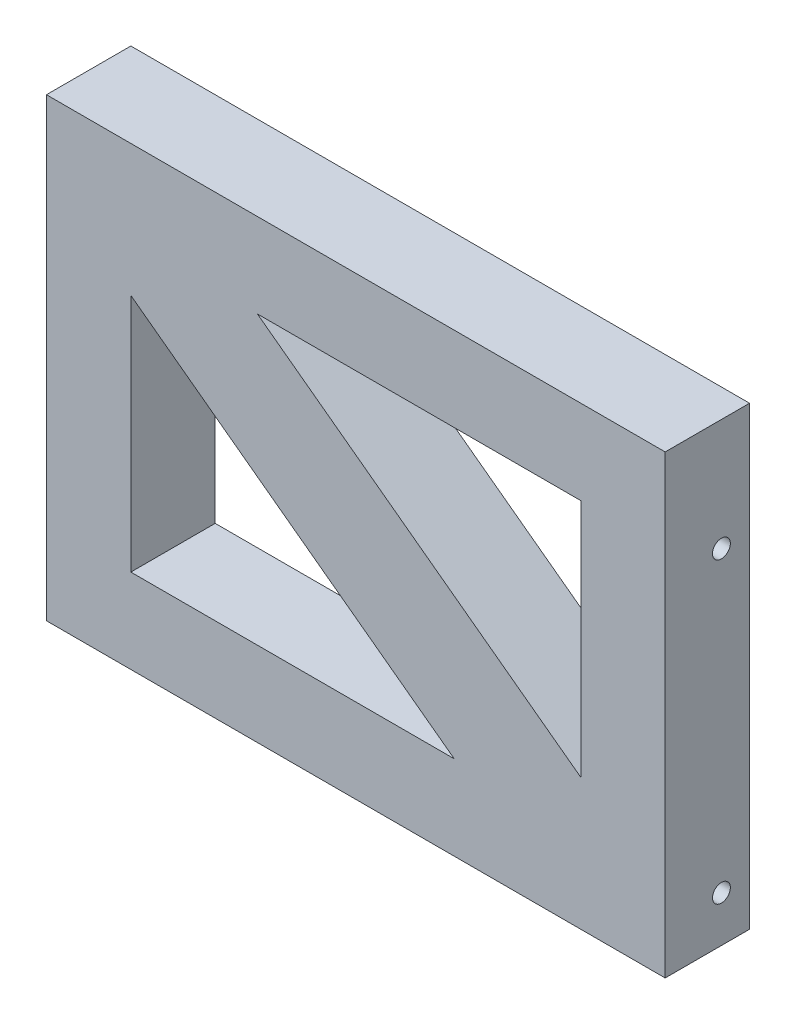
ISO-10303-21;
HEADER;
FILE_DESCRIPTION(('STEP AP214'),'2;1');
FILE_NAME('part.step','',(''),(''),'','','');
FILE_SCHEMA(('AUTOMOTIVE_DESIGN { 1 0 10303 214 1 1 1 1 }'));
ENDSEC;
DATA;
#1=APPLICATION_CONTEXT('core data for automotive mechanical design processes');
#2=APPLICATION_PROTOCOL_DEFINITION('international standard','automotive_design',2000,#1);
#3=PRODUCT_CONTEXT('',#1,'mechanical');
#4=PRODUCT('Part','Part','',(#3));
#5=PRODUCT_RELATED_PRODUCT_CATEGORY('part','',(#4));
#6=PRODUCT_DEFINITION_FORMATION('','',#4);
#7=PRODUCT_DEFINITION_CONTEXT('part definition',#1,'design');
#8=PRODUCT_DEFINITION('design','',#6,#7);
#9=PRODUCT_DEFINITION_SHAPE('','',#8);
#10=(LENGTH_UNIT() NAMED_UNIT(*) SI_UNIT(.MILLI.,.METRE.));
#11=(NAMED_UNIT(*) PLANE_ANGLE_UNIT() SI_UNIT($,.RADIAN.));
#12=(NAMED_UNIT(*) SI_UNIT($,.STERADIAN.) SOLID_ANGLE_UNIT());
#13=UNCERTAINTY_MEASURE_WITH_UNIT(LENGTH_MEASURE(1.E-05),#10,'distance_accuracy_value','');
#14=(GEOMETRIC_REPRESENTATION_CONTEXT(3) GLOBAL_UNCERTAINTY_ASSIGNED_CONTEXT((#13)) GLOBAL_UNIT_ASSIGNED_CONTEXT((#10,
#11,#12)) REPRESENTATION_CONTEXT('',''));
#15=CARTESIAN_POINT('',(0.,0.,0.));
#16=DIRECTION('',(0.,0.,1.));
#17=DIRECTION('',(1.,0.,0.));
#18=AXIS2_PLACEMENT_3D('',#15,#16,#17);
#19=CARTESIAN_POINT('',(0.,102.87,19.05));
#20=DIRECTION('',(0.,0.,-1.));
#21=DIRECTION('',(-1.,0.,0.));
#22=AXIS2_PLACEMENT_3D('',#19,#20,#21);
#23=PLANE('',#22);
#24=DIRECTION('',(1.,0.,0.));
#25=VECTOR('',#24,1.);
#26=CARTESIAN_POINT('',(19.05,19.05,19.05));
#27=LINE('',#26,#25);
#28=CARTESIAN_POINT('',(19.05,19.05,19.05));
#29=VERTEX_POINT('',#28);
#30=CARTESIAN_POINT('',(92.075,19.05,19.05));
#31=VERTEX_POINT('',#30);
#32=EDGE_CURVE('E177',#29,#31,#27,.T.);
#33=ORIENTED_EDGE('',*,*,#32,.F.);
#34=DIRECTION('',(0.,-1.,0.));
#35=VECTOR('',#34,1.);
#36=CARTESIAN_POINT('',(19.05,19.05,19.05));
#37=LINE('',#36,#35);
#38=CARTESIAN_POINT('',(19.05,73.152,19.05));
#39=VERTEX_POINT('',#38);
#40=EDGE_CURVE('E183',#39,#29,#37,.T.);
#41=ORIENTED_EDGE('',*,*,#40,.F.);
#42=DIRECTION('',(-0.803507681099584,0.595294386345083,0.));
#43=VECTOR('',#42,1.);
#44=CARTESIAN_POINT('',(19.05,73.152,19.05));
#45=LINE('',#44,#43);
#46=EDGE_CURVE('E179',#31,#39,#45,.T.);
#47=ORIENTED_EDGE('',*,*,#46,.F.);
#48=EDGE_LOOP('',(#33,#41,#47));
#49=FACE_BOUND('',#48,.T.);
#50=DIRECTION('',(0.,-1.,0.));
#51=VECTOR('',#50,1.);
#52=CARTESIAN_POINT('',(0.,0.,19.05));
#53=LINE('',#52,#51);
#54=CARTESIAN_POINT('',(0.,102.87,19.05));
#55=VERTEX_POINT('',#54);
#56=CARTESIAN_POINT('',(0.,0.,19.05));
#57=VERTEX_POINT('',#56);
#58=EDGE_CURVE('E201',#55,#57,#53,.T.);
#59=ORIENTED_EDGE('',*,*,#58,.T.);
#60=DIRECTION('',(1.,0.,0.));
#61=VECTOR('',#60,1.);
#62=CARTESIAN_POINT('',(0.,0.,19.05));
#63=LINE('',#62,#61);
#64=CARTESIAN_POINT('',(139.7,0.,19.05));
#65=VERTEX_POINT('',#64);
#66=EDGE_CURVE('E204',#57,#65,#63,.T.);
#67=ORIENTED_EDGE('',*,*,#66,.T.);
#68=DIRECTION('',(0.,1.,0.));
#69=VECTOR('',#68,1.);
#70=CARTESIAN_POINT('',(139.7,0.,19.05));
#71=LINE('',#70,#69);
#72=CARTESIAN_POINT('',(139.7,102.87,19.05));
#73=VERTEX_POINT('',#72);
#74=EDGE_CURVE('E207',#65,#73,#71,.T.);
#75=ORIENTED_EDGE('',*,*,#74,.T.);
#76=DIRECTION('',(-1.,0.,0.));
#77=VECTOR('',#76,1.);
#78=CARTESIAN_POINT('',(0.,102.87,19.05));
#79=LINE('',#78,#77);
#80=EDGE_CURVE('E209',#73,#55,#79,.T.);
#81=ORIENTED_EDGE('',*,*,#80,.T.);
#82=EDGE_LOOP('',(#59,#67,#75,#81));
#83=FACE_BOUND('',#82,.T.);
#84=DIRECTION('',(-1.,0.,0.));
#85=VECTOR('',#84,1.);
#86=CARTESIAN_POINT('',(120.65,83.82,19.05));
#87=LINE('',#86,#85);
#88=CARTESIAN_POINT('',(120.65,83.82,19.05));
#89=VERTEX_POINT('',#88);
#90=CARTESIAN_POINT('',(47.625,83.82,19.05));
#91=VERTEX_POINT('',#90);
#92=EDGE_CURVE('E158',#89,#91,#87,.T.);
#93=ORIENTED_EDGE('',*,*,#92,.F.);
#94=DIRECTION('',(0.,1.,0.));
#95=VECTOR('',#94,1.);
#96=CARTESIAN_POINT('',(120.65,83.82,19.05));
#97=LINE('',#96,#95);
#98=CARTESIAN_POINT('',(120.65,29.718,19.05));
#99=VERTEX_POINT('',#98);
#100=EDGE_CURVE('E163',#99,#89,#97,.T.);
#101=ORIENTED_EDGE('',*,*,#100,.F.);
#102=DIRECTION('',(0.803507681099584,-0.595294386345083,0.));
#103=VECTOR('',#102,1.);
#104=CARTESIAN_POINT('',(47.625,83.82,19.05));
#105=LINE('',#104,#103);
#106=EDGE_CURVE('E160',#91,#99,#105,.T.);
#107=ORIENTED_EDGE('',*,*,#106,.F.);
#108=EDGE_LOOP('',(#93,#101,#107));
#109=FACE_BOUND('',#108,.T.);
#110=ADVANCED_FACE('F36',(#49,#83,#109),#23,.F.);
#111=CARTESIAN_POINT('',(0.,102.87,0.));
#112=DIRECTION('',(0.,0.,-1.));
#113=DIRECTION('',(-1.,0.,0.));
#114=AXIS2_PLACEMENT_3D('',#111,#112,#113);
#115=PLANE('',#114);
#116=DIRECTION('',(0.,-1.,0.));
#117=VECTOR('',#116,1.);
#118=CARTESIAN_POINT('',(19.05,19.05,0.));
#119=LINE('',#118,#117);
#120=CARTESIAN_POINT('',(19.05,73.152,0.));
#121=VERTEX_POINT('',#120);
#122=CARTESIAN_POINT('',(19.05,19.05,0.));
#123=VERTEX_POINT('',#122);
#124=EDGE_CURVE('E180',#121,#123,#119,.T.);
#125=ORIENTED_EDGE('',*,*,#124,.T.);
#126=DIRECTION('',(1.,0.,0.));
#127=VECTOR('',#126,1.);
#128=CARTESIAN_POINT('',(19.05,19.05,0.));
#129=LINE('',#128,#127);
#130=CARTESIAN_POINT('',(92.075,19.05,0.));
#131=VERTEX_POINT('',#130);
#132=EDGE_CURVE('E176',#123,#131,#129,.T.);
#133=ORIENTED_EDGE('',*,*,#132,.T.);
#134=DIRECTION('',(-0.803507681099584,0.595294386345083,0.));
#135=VECTOR('',#134,1.);
#136=CARTESIAN_POINT('',(19.05,73.152,0.));
#137=LINE('',#136,#135);
#138=EDGE_CURVE('E188',#131,#121,#137,.T.);
#139=ORIENTED_EDGE('',*,*,#138,.T.);
#140=EDGE_LOOP('',(#125,#133,#139));
#141=FACE_BOUND('',#140,.T.);
#142=DIRECTION('',(0.,-1.,0.));
#143=VECTOR('',#142,1.);
#144=CARTESIAN_POINT('',(0.,0.,0.));
#145=LINE('',#144,#143);
#146=CARTESIAN_POINT('',(0.,102.87,0.));
#147=VERTEX_POINT('',#146);
#148=CARTESIAN_POINT('',(0.,0.,0.));
#149=VERTEX_POINT('',#148);
#150=EDGE_CURVE('E200',#147,#149,#145,.T.);
#151=ORIENTED_EDGE('',*,*,#150,.F.);
#152=DIRECTION('',(-1.,0.,0.));
#153=VECTOR('',#152,1.);
#154=CARTESIAN_POINT('',(0.,102.87,0.));
#155=LINE('',#154,#153);
#156=CARTESIAN_POINT('',(139.7,102.87,0.));
#157=VERTEX_POINT('',#156);
#158=EDGE_CURVE('E205',#157,#147,#155,.T.);
#159=ORIENTED_EDGE('',*,*,#158,.F.);
#160=DIRECTION('',(0.,1.,0.));
#161=VECTOR('',#160,1.);
#162=CARTESIAN_POINT('',(139.7,0.,0.));
#163=LINE('',#162,#161);
#164=CARTESIAN_POINT('',(139.7,0.,0.));
#165=VERTEX_POINT('',#164);
#166=EDGE_CURVE('E216',#165,#157,#163,.T.);
#167=ORIENTED_EDGE('',*,*,#166,.F.);
#168=DIRECTION('',(1.,0.,0.));
#169=VECTOR('',#168,1.);
#170=CARTESIAN_POINT('',(0.,0.,0.));
#171=LINE('',#170,#169);
#172=EDGE_CURVE('E214',#149,#165,#171,.T.);
#173=ORIENTED_EDGE('',*,*,#172,.F.);
#174=EDGE_LOOP('',(#151,#159,#167,#173));
#175=FACE_BOUND('',#174,.T.);
#176=DIRECTION('',(0.,1.,0.));
#177=VECTOR('',#176,1.);
#178=CARTESIAN_POINT('',(120.65,83.82,0.));
#179=LINE('',#178,#177);
#180=CARTESIAN_POINT('',(120.65,29.718,0.));
#181=VERTEX_POINT('',#180);
#182=CARTESIAN_POINT('',(120.65,83.82,0.));
#183=VERTEX_POINT('',#182);
#184=EDGE_CURVE('E161',#181,#183,#179,.T.);
#185=ORIENTED_EDGE('',*,*,#184,.T.);
#186=DIRECTION('',(-1.,0.,0.));
#187=VECTOR('',#186,1.);
#188=CARTESIAN_POINT('',(120.65,83.82,0.));
#189=LINE('',#188,#187);
#190=CARTESIAN_POINT('',(47.625,83.82,0.));
#191=VERTEX_POINT('',#190);
#192=EDGE_CURVE('E59',#183,#191,#189,.T.);
#193=ORIENTED_EDGE('',*,*,#192,.T.);
#194=DIRECTION('',(0.803507681099584,-0.595294386345083,0.));
#195=VECTOR('',#194,1.);
#196=CARTESIAN_POINT('',(47.625,83.82,0.));
#197=LINE('',#196,#195);
#198=EDGE_CURVE('E167',#191,#181,#197,.T.);
#199=ORIENTED_EDGE('',*,*,#198,.T.);
#200=EDGE_LOOP('',(#185,#193,#199));
#201=FACE_BOUND('',#200,.T.);
#202=ADVANCED_FACE('F234',(#141,#175,#201),#115,.T.);
#203=CARTESIAN_POINT('',(0.,0.,19.05));
#204=DIRECTION('',(1.,0.,0.));
#205=DIRECTION('',(0.,0.,-1.));
#206=AXIS2_PLACEMENT_3D('',#203,#204,#205);
#207=PLANE('',#206);
#208=CARTESIAN_POINT('',(0.,77.63256,6.35));
#209=DIRECTION('',(-1.,0.,0.));
#210=DIRECTION('',(0.,0.,1.));
#211=AXIS2_PLACEMENT_3D('',#208,#209,#210);
#212=CIRCLE('',#211,2.01929999999999);
#213=CARTESIAN_POINT('',(0.,77.63256,8.36929999999999));
#214=VERTEX_POINT('',#213);
#215=EDGE_CURVE('E136',#214,#214,#212,.T.);
#216=ORIENTED_EDGE('',*,*,#215,.F.);
#217=EDGE_LOOP('',(#216));
#218=FACE_BOUND('',#217,.T.);
#219=CARTESIAN_POINT('',(0.,10.32256,6.35));
#220=DIRECTION('',(-1.,0.,0.));
#221=DIRECTION('',(0.,0.,1.));
#222=AXIS2_PLACEMENT_3D('',#219,#220,#221);
#223=CIRCLE('',#222,2.01929999999999);
#224=CARTESIAN_POINT('',(0.,10.32256,8.36929999999999));
#225=VERTEX_POINT('',#224);
#226=EDGE_CURVE('E135',#225,#225,#223,.T.);
#227=ORIENTED_EDGE('',*,*,#226,.F.);
#228=EDGE_LOOP('',(#227));
#229=FACE_BOUND('',#228,.T.);
#230=ORIENTED_EDGE('',*,*,#150,.T.);
#231=DIRECTION('',(0.,0.,-1.));
#232=VECTOR('',#231,1.);
#233=CARTESIAN_POINT('',(0.,0.,19.05));
#234=LINE('',#233,#232);
#235=EDGE_CURVE('E11',#57,#149,#234,.T.);
#236=ORIENTED_EDGE('',*,*,#235,.F.);
#237=ORIENTED_EDGE('',*,*,#58,.F.);
#238=DIRECTION('',(0.,0.,-1.));
#239=VECTOR('',#238,1.);
#240=CARTESIAN_POINT('',(0.,102.87,19.05));
#241=LINE('',#240,#239);
#242=EDGE_CURVE('E211',#55,#147,#241,.T.);
#243=ORIENTED_EDGE('',*,*,#242,.T.);
#244=EDGE_LOOP('',(#230,#236,#237,#243));
#245=FACE_BOUND('',#244,.T.);
#246=ADVANCED_FACE('F38',(#218,#229,#245),#207,.F.);
#247=CARTESIAN_POINT('',(0.,0.,19.05));
#248=DIRECTION('',(0.,1.,0.));
#249=DIRECTION('',(0.,0.,1.));
#250=AXIS2_PLACEMENT_3D('',#247,#248,#249);
#251=PLANE('',#250);
#252=ORIENTED_EDGE('',*,*,#172,.T.);
#253=DIRECTION('',(0.,0.,-1.));
#254=VECTOR('',#253,1.);
#255=CARTESIAN_POINT('',(139.7,0.,19.05));
#256=LINE('',#255,#254);
#257=EDGE_CURVE('E44',#65,#165,#256,.T.);
#258=ORIENTED_EDGE('',*,*,#257,.F.);
#259=ORIENTED_EDGE('',*,*,#66,.F.);
#260=ORIENTED_EDGE('',*,*,#235,.T.);
#261=EDGE_LOOP('',(#252,#258,#259,#260));
#262=FACE_BOUND('',#261,.T.);
#263=ADVANCED_FACE('F245',(#262),#251,.F.);
#264=CARTESIAN_POINT('',(139.7,0.,19.05));
#265=DIRECTION('',(-1.,0.,0.));
#266=DIRECTION('',(0.,0.,1.));
#267=AXIS2_PLACEMENT_3D('',#264,#265,#266);
#268=PLANE('',#267);
#269=CARTESIAN_POINT('',(139.7,10.32256,6.35));
#270=DIRECTION('',(1.,0.,0.));
#271=DIRECTION('',(0.,0.,-1.));
#272=AXIS2_PLACEMENT_3D('',#269,#270,#271);
#273=CIRCLE('',#272,2.01929999999999);
#274=CARTESIAN_POINT('',(139.7,10.32256,4.33070000000001));
#275=VERTEX_POINT('',#274);
#276=EDGE_CURVE('E146',#275,#275,#273,.T.);
#277=ORIENTED_EDGE('',*,*,#276,.F.);
#278=EDGE_LOOP('',(#277));
#279=FACE_BOUND('',#278,.T.);
#280=CARTESIAN_POINT('',(139.7,77.63256,6.35));
#281=DIRECTION('',(1.,0.,0.));
#282=DIRECTION('',(0.,0.,-1.));
#283=AXIS2_PLACEMENT_3D('',#280,#281,#282);
#284=CIRCLE('',#283,2.01929999999999);
#285=CARTESIAN_POINT('',(139.7,77.63256,4.33070000000001));
#286=VERTEX_POINT('',#285);
#287=EDGE_CURVE('E152',#286,#286,#284,.T.);
#288=ORIENTED_EDGE('',*,*,#287,.F.);
#289=EDGE_LOOP('',(#288));
#290=FACE_BOUND('',#289,.T.);
#291=ORIENTED_EDGE('',*,*,#166,.T.);
#292=DIRECTION('',(0.,0.,-1.));
#293=VECTOR('',#292,1.);
#294=CARTESIAN_POINT('',(139.7,102.87,19.05));
#295=LINE('',#294,#293);
#296=EDGE_CURVE('E221',#73,#157,#295,.T.);
#297=ORIENTED_EDGE('',*,*,#296,.F.);
#298=ORIENTED_EDGE('',*,*,#74,.F.);
#299=ORIENTED_EDGE('',*,*,#257,.T.);
#300=EDGE_LOOP('',(#291,#297,#298,#299));
#301=FACE_BOUND('',#300,.T.);
#302=ADVANCED_FACE('F228',(#279,#290,#301),#268,.F.);
#303=CARTESIAN_POINT('',(0.,102.87,19.05));
#304=DIRECTION('',(0.,-1.,0.));
#305=DIRECTION('',(0.,0.,-1.));
#306=AXIS2_PLACEMENT_3D('',#303,#304,#305);
#307=PLANE('',#306);
#308=ORIENTED_EDGE('',*,*,#158,.T.);
#309=ORIENTED_EDGE('',*,*,#242,.F.);
#310=ORIENTED_EDGE('',*,*,#80,.F.);
#311=ORIENTED_EDGE('',*,*,#296,.T.);
#312=EDGE_LOOP('',(#308,#309,#310,#311));
#313=FACE_BOUND('',#312,.T.);
#314=ADVANCED_FACE('F238',(#313),#307,.F.);
#315=CARTESIAN_POINT('',(19.05,19.05,19.05));
#316=DIRECTION('',(0.,1.,0.));
#317=DIRECTION('',(0.,0.,1.));
#318=AXIS2_PLACEMENT_3D('',#315,#316,#317);
#319=PLANE('',#318);
#320=ORIENTED_EDGE('',*,*,#132,.F.);
#321=DIRECTION('',(0.,0.,-1.));
#322=VECTOR('',#321,1.);
#323=CARTESIAN_POINT('',(19.05,19.05,19.05));
#324=LINE('',#323,#322);
#325=EDGE_CURVE('E185',#29,#123,#324,.T.);
#326=ORIENTED_EDGE('',*,*,#325,.F.);
#327=ORIENTED_EDGE('',*,*,#32,.T.);
#328=DIRECTION('',(0.,0.,-1.));
#329=VECTOR('',#328,1.);
#330=CARTESIAN_POINT('',(92.075,19.05,19.05));
#331=LINE('',#330,#329);
#332=EDGE_CURVE('E197',#31,#131,#331,.T.);
#333=ORIENTED_EDGE('',*,*,#332,.T.);
#334=EDGE_LOOP('',(#320,#326,#327,#333));
#335=FACE_BOUND('',#334,.T.);
#336=ADVANCED_FACE('F264',(#335),#319,.T.);
#337=CARTESIAN_POINT('',(19.05,73.152,19.05));
#338=DIRECTION('',(-0.595294386345083,-0.803507681099584,0.));
#339=DIRECTION('',(0.803507681099584,-0.595294386345083,0.));
#340=AXIS2_PLACEMENT_3D('',#337,#338,#339);
#341=PLANE('',#340);
#342=ORIENTED_EDGE('',*,*,#138,.F.);
#343=ORIENTED_EDGE('',*,*,#332,.F.);
#344=ORIENTED_EDGE('',*,*,#46,.T.);
#345=DIRECTION('',(0.,0.,-1.));
#346=VECTOR('',#345,1.);
#347=CARTESIAN_POINT('',(19.05,73.152,19.05));
#348=LINE('',#347,#346);
#349=EDGE_CURVE('E195',#39,#121,#348,.T.);
#350=ORIENTED_EDGE('',*,*,#349,.T.);
#351=EDGE_LOOP('',(#342,#343,#344,#350));
#352=FACE_BOUND('',#351,.T.);
#353=ADVANCED_FACE('F271',(#352),#341,.T.);
#354=CARTESIAN_POINT('',(19.05,19.05,19.05));
#355=DIRECTION('',(1.,0.,0.));
#356=DIRECTION('',(0.,0.,-1.));
#357=AXIS2_PLACEMENT_3D('',#354,#355,#356);
#358=PLANE('',#357);
#359=ORIENTED_EDGE('',*,*,#124,.F.);
#360=ORIENTED_EDGE('',*,*,#349,.F.);
#361=ORIENTED_EDGE('',*,*,#40,.T.);
#362=ORIENTED_EDGE('',*,*,#325,.T.);
#363=EDGE_LOOP('',(#359,#360,#361,#362));
#364=FACE_BOUND('',#363,.T.);
#365=ADVANCED_FACE('F276',(#364),#358,.T.);
#366=CARTESIAN_POINT('',(120.65,83.82,19.05));
#367=DIRECTION('',(0.,-1.,0.));
#368=DIRECTION('',(1.,0.,0.));
#369=AXIS2_PLACEMENT_3D('',#366,#367,#368);
#370=PLANE('',#369);
#371=ORIENTED_EDGE('',*,*,#192,.F.);
#372=DIRECTION('',(0.,0.,-1.));
#373=VECTOR('',#372,1.);
#374=CARTESIAN_POINT('',(120.65,83.82,19.05));
#375=LINE('',#374,#373);
#376=EDGE_CURVE('E165',#89,#183,#375,.T.);
#377=ORIENTED_EDGE('',*,*,#376,.F.);
#378=ORIENTED_EDGE('',*,*,#92,.T.);
#379=DIRECTION('',(0.,0.,-1.));
#380=VECTOR('',#379,1.);
#381=CARTESIAN_POINT('',(47.625,83.82,19.05));
#382=LINE('',#381,#380);
#383=EDGE_CURVE('E174',#91,#191,#382,.T.);
#384=ORIENTED_EDGE('',*,*,#383,.T.);
#385=EDGE_LOOP('',(#371,#377,#378,#384));
#386=FACE_BOUND('',#385,.T.);
#387=ADVANCED_FACE('F285',(#386),#370,.T.);
#388=CARTESIAN_POINT('',(47.625,83.82,19.05));
#389=DIRECTION('',(0.595294386345083,0.803507681099584,0.));
#390=DIRECTION('',(-0.803507681099584,0.595294386345083,0.));
#391=AXIS2_PLACEMENT_3D('',#388,#389,#390);
#392=PLANE('',#391);
#393=ORIENTED_EDGE('',*,*,#198,.F.);
#394=ORIENTED_EDGE('',*,*,#383,.F.);
#395=ORIENTED_EDGE('',*,*,#106,.T.);
#396=DIRECTION('',(0.,0.,-1.));
#397=VECTOR('',#396,1.);
#398=CARTESIAN_POINT('',(120.65,29.718,19.05));
#399=LINE('',#398,#397);
#400=EDGE_CURVE('E51',#99,#181,#399,.T.);
#401=ORIENTED_EDGE('',*,*,#400,.T.);
#402=EDGE_LOOP('',(#393,#394,#395,#401));
#403=FACE_BOUND('',#402,.T.);
#404=ADVANCED_FACE('F290',(#403),#392,.T.);
#405=CARTESIAN_POINT('',(120.65,83.82,19.05));
#406=DIRECTION('',(-1.,0.,0.));
#407=DIRECTION('',(0.,-1.,0.));
#408=AXIS2_PLACEMENT_3D('',#405,#406,#407);
#409=PLANE('',#408);
#410=ORIENTED_EDGE('',*,*,#184,.F.);
#411=ORIENTED_EDGE('',*,*,#400,.F.);
#412=ORIENTED_EDGE('',*,*,#100,.T.);
#413=ORIENTED_EDGE('',*,*,#376,.T.);
#414=EDGE_LOOP('',(#410,#411,#412,#413));
#415=FACE_BOUND('',#414,.T.);
#416=ADVANCED_FACE('F295',(#415),#409,.T.);
#417=CARTESIAN_POINT('',(125.984,77.63256,6.35));
#418=DIRECTION('',(1.,0.,0.));
#419=DIRECTION('',(0.,0.,-1.));
#420=AXIS2_PLACEMENT_3D('',#417,#418,#419);
#421=CONICAL_SURFACE('',#420,2.01929999999999,1.02974425867665);
#422=CARTESIAN_POINT('',(124.770682151998,77.63256,6.35));
#423=VERTEX_POINT('',#422);
#424=VERTEX_LOOP('',#423);
#425=FACE_BOUND('',#424,.T.);
#426=CARTESIAN_POINT('',(125.984,77.63256,6.35));
#427=DIRECTION('',(1.,0.,0.));
#428=DIRECTION('',(0.,0.,-1.));
#429=AXIS2_PLACEMENT_3D('',#426,#427,#428);
#430=CIRCLE('',#429,2.01929999999999);
#431=CARTESIAN_POINT('',(125.984,77.63256,4.33070000000001));
#432=VERTEX_POINT('',#431);
#433=EDGE_CURVE('E155',#432,#432,#430,.T.);
#434=ORIENTED_EDGE('',*,*,#433,.T.);
#435=EDGE_LOOP('',(#434));
#436=FACE_BOUND('',#435,.T.);
#437=ADVANCED_FACE('F299',(#425,#436),#421,.F.);
#438=CARTESIAN_POINT('',(139.7,77.63256,6.35));
#439=DIRECTION('',(1.,0.,0.));
#440=DIRECTION('',(0.,0.,-1.));
#441=AXIS2_PLACEMENT_3D('',#438,#439,#440);
#442=CYLINDRICAL_SURFACE('',#441,2.01929999999999);
#443=ORIENTED_EDGE('',*,*,#433,.F.);
#444=EDGE_LOOP('',(#443));
#445=FACE_BOUND('',#444,.T.);
#446=ORIENTED_EDGE('',*,*,#287,.T.);
#447=EDGE_LOOP('',(#446));
#448=FACE_BOUND('',#447,.T.);
#449=ADVANCED_FACE('F302',(#445,#448),#442,.F.);
#450=CARTESIAN_POINT('',(125.984,10.32256,6.35));
#451=DIRECTION('',(1.,0.,0.));
#452=DIRECTION('',(0.,0.,-1.));
#453=AXIS2_PLACEMENT_3D('',#450,#451,#452);
#454=CONICAL_SURFACE('',#453,2.01929999999999,1.02974425867665);
#455=CARTESIAN_POINT('',(124.770682151998,10.32256,6.35));
#456=VERTEX_POINT('',#455);
#457=VERTEX_LOOP('',#456);
#458=FACE_BOUND('',#457,.T.);
#459=CARTESIAN_POINT('',(125.984,10.32256,6.35));
#460=DIRECTION('',(1.,0.,0.));
#461=DIRECTION('',(0.,0.,-1.));
#462=AXIS2_PLACEMENT_3D('',#459,#460,#461);
#463=CIRCLE('',#462,2.01929999999999);
#464=CARTESIAN_POINT('',(125.984,10.32256,4.33070000000001));
#465=VERTEX_POINT('',#464);
#466=EDGE_CURVE('E149',#465,#465,#463,.T.);
#467=ORIENTED_EDGE('',*,*,#466,.T.);
#468=EDGE_LOOP('',(#467));
#469=FACE_BOUND('',#468,.T.);
#470=ADVANCED_FACE('F306',(#458,#469),#454,.F.);
#471=CARTESIAN_POINT('',(139.7,10.32256,6.35));
#472=DIRECTION('',(1.,0.,0.));
#473=DIRECTION('',(0.,0.,-1.));
#474=AXIS2_PLACEMENT_3D('',#471,#472,#473);
#475=CYLINDRICAL_SURFACE('',#474,2.01929999999999);
#476=ORIENTED_EDGE('',*,*,#466,.F.);
#477=EDGE_LOOP('',(#476));
#478=FACE_BOUND('',#477,.T.);
#479=ORIENTED_EDGE('',*,*,#276,.T.);
#480=EDGE_LOOP('',(#479));
#481=FACE_BOUND('',#480,.T.);
#482=ADVANCED_FACE('F310',(#478,#481),#475,.F.);
#483=CARTESIAN_POINT('',(13.716,10.32256,6.35));
#484=DIRECTION('',(-1.,0.,0.));
#485=DIRECTION('',(0.,0.,1.));
#486=AXIS2_PLACEMENT_3D('',#483,#484,#485);
#487=CONICAL_SURFACE('',#486,2.01929999999999,1.02974425867665);
#488=CARTESIAN_POINT('',(14.9293178480024,10.32256,6.35));
#489=VERTEX_POINT('',#488);
#490=VERTEX_LOOP('',#489);
#491=FACE_BOUND('',#490,.T.);
#492=CARTESIAN_POINT('',(13.716,10.32256,6.35));
#493=DIRECTION('',(-1.,0.,0.));
#494=DIRECTION('',(0.,0.,1.));
#495=AXIS2_PLACEMENT_3D('',#492,#493,#494);
#496=CIRCLE('',#495,2.01929999999999);
#497=CARTESIAN_POINT('',(13.716,10.32256,8.36929999999999));
#498=VERTEX_POINT('',#497);
#499=EDGE_CURVE('E139',#498,#498,#496,.T.);
#500=ORIENTED_EDGE('',*,*,#499,.T.);
#501=EDGE_LOOP('',(#500));
#502=FACE_BOUND('',#501,.T.);
#503=ADVANCED_FACE('F314',(#491,#502),#487,.F.);
#504=CARTESIAN_POINT('',(0.,10.32256,6.35));
#505=DIRECTION('',(-1.,0.,0.));
#506=DIRECTION('',(0.,0.,1.));
#507=AXIS2_PLACEMENT_3D('',#504,#505,#506);
#508=CYLINDRICAL_SURFACE('',#507,2.01929999999999);
#509=ORIENTED_EDGE('',*,*,#499,.F.);
#510=EDGE_LOOP('',(#509));
#511=FACE_BOUND('',#510,.T.);
#512=ORIENTED_EDGE('',*,*,#226,.T.);
#513=EDGE_LOOP('',(#512));
#514=FACE_BOUND('',#513,.T.);
#515=ADVANCED_FACE('F129',(#511,#514),#508,.F.);
#516=CARTESIAN_POINT('',(13.716,77.63256,6.35));
#517=DIRECTION('',(-1.,0.,0.));
#518=DIRECTION('',(0.,0.,1.));
#519=AXIS2_PLACEMENT_3D('',#516,#517,#518);
#520=CONICAL_SURFACE('',#519,2.01929999999999,1.02974425867665);
#521=CARTESIAN_POINT('',(14.9293178480024,77.63256,6.35));
#522=VERTEX_POINT('',#521);
#523=VERTEX_LOOP('',#522);
#524=FACE_BOUND('',#523,.T.);
#525=CARTESIAN_POINT('',(13.716,77.63256,6.35));
#526=DIRECTION('',(-1.,0.,0.));
#527=DIRECTION('',(0.,0.,1.));
#528=AXIS2_PLACEMENT_3D('',#525,#526,#527);
#529=CIRCLE('',#528,2.01929999999999);
#530=CARTESIAN_POINT('',(13.716,77.63256,8.36929999999999));
#531=VERTEX_POINT('',#530);
#532=EDGE_CURVE('E133',#531,#531,#529,.T.);
#533=ORIENTED_EDGE('',*,*,#532,.T.);
#534=EDGE_LOOP('',(#533));
#535=FACE_BOUND('',#534,.T.);
#536=ADVANCED_FACE('F125',(#524,#535),#520,.F.);
#537=CARTESIAN_POINT('',(0.,77.63256,6.35));
#538=DIRECTION('',(-1.,0.,0.));
#539=DIRECTION('',(0.,0.,1.));
#540=AXIS2_PLACEMENT_3D('',#537,#538,#539);
#541=CYLINDRICAL_SURFACE('',#540,2.01929999999999);
#542=ORIENTED_EDGE('',*,*,#532,.F.);
#543=EDGE_LOOP('',(#542));
#544=FACE_BOUND('',#543,.T.);
#545=ORIENTED_EDGE('',*,*,#215,.T.);
#546=EDGE_LOOP('',(#545));
#547=FACE_BOUND('',#546,.T.);
#548=ADVANCED_FACE('F128',(#544,#547),#541,.F.);
#549=CLOSED_SHELL('',(#110,#202,#246,#263,#302,#314,#336,#353,#365,#387,#404,#416,#437,#449,
#470,#482,#503,#515,#536,#548));
#550=MANIFOLD_SOLID_BREP('B2',#549);
#551=ADVANCED_BREP_SHAPE_REPRESENTATION('',(#18,#550),#14);
#552=SHAPE_DEFINITION_REPRESENTATION(#9,#551);
ENDSEC;
END-ISO-10303-21;
